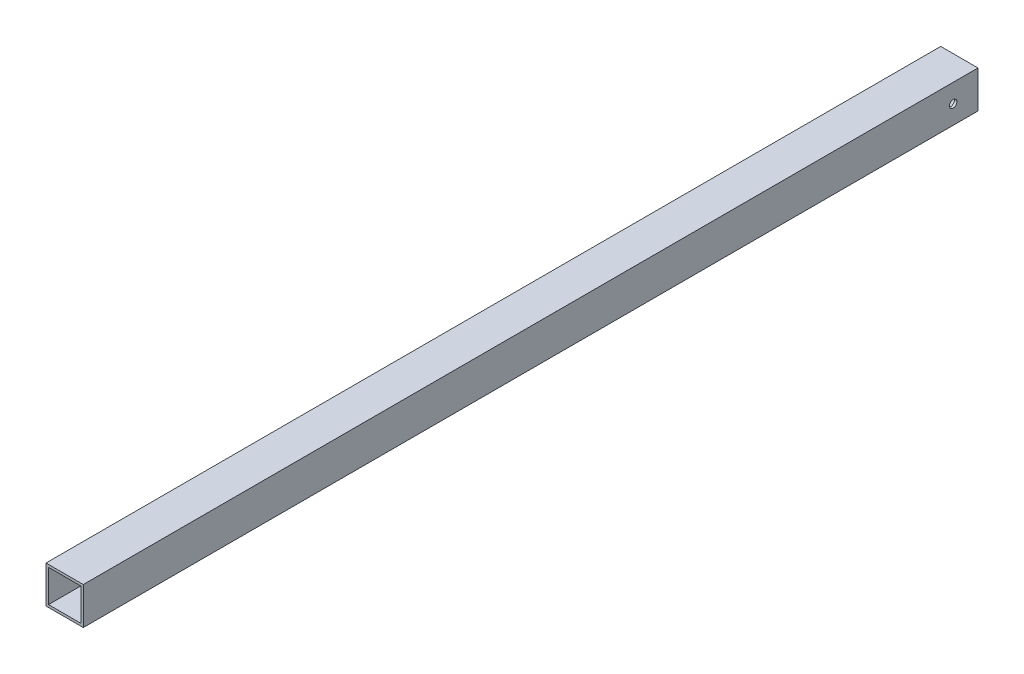
ISO-10303-21;
HEADER;
FILE_DESCRIPTION(('STEP AP214'),'2;1');
FILE_NAME('part.step','',(''),(''),'','','');
FILE_SCHEMA(('AUTOMOTIVE_DESIGN { 1 0 10303 214 1 1 1 1 }'));
ENDSEC;
DATA;
#1=APPLICATION_CONTEXT('core data for automotive mechanical design processes');
#2=APPLICATION_PROTOCOL_DEFINITION('international standard','automotive_design',2000,#1);
#3=PRODUCT_CONTEXT('',#1,'mechanical');
#4=PRODUCT('Part','Part','',(#3));
#5=PRODUCT_RELATED_PRODUCT_CATEGORY('part','',(#4));
#6=PRODUCT_DEFINITION_FORMATION('','',#4);
#7=PRODUCT_DEFINITION_CONTEXT('part definition',#1,'design');
#8=PRODUCT_DEFINITION('design','',#6,#7);
#9=PRODUCT_DEFINITION_SHAPE('','',#8);
#10=(LENGTH_UNIT() NAMED_UNIT(*) SI_UNIT(.MILLI.,.METRE.));
#11=(NAMED_UNIT(*) PLANE_ANGLE_UNIT() SI_UNIT($,.RADIAN.));
#12=(NAMED_UNIT(*) SI_UNIT($,.STERADIAN.) SOLID_ANGLE_UNIT());
#13=UNCERTAINTY_MEASURE_WITH_UNIT(LENGTH_MEASURE(1.E-05),#10,'distance_accuracy_value','');
#14=(GEOMETRIC_REPRESENTATION_CONTEXT(3) GLOBAL_UNCERTAINTY_ASSIGNED_CONTEXT((#13)) GLOBAL_UNIT_ASSIGNED_CONTEXT((#10,
#11,#12)) REPRESENTATION_CONTEXT('',''));
#15=CARTESIAN_POINT('',(0.,0.,0.));
#16=DIRECTION('',(0.,0.,1.));
#17=DIRECTION('',(1.,0.,0.));
#18=AXIS2_PLACEMENT_3D('',#15,#16,#17);
#19=CARTESIAN_POINT('',(0.,0.,360.));
#20=DIRECTION('',(0.,0.,1.));
#21=DIRECTION('',(1.,0.,0.));
#22=AXIS2_PLACEMENT_3D('',#19,#20,#21);
#23=PLANE('',#22);
#24=DIRECTION('',(0.,1.,0.));
#25=VECTOR('',#24,1.);
#26=CARTESIAN_POINT('',(7.5,7.5,360.));
#27=LINE('',#26,#25);
#28=CARTESIAN_POINT('',(7.5,-7.5,360.));
#29=VERTEX_POINT('',#28);
#30=CARTESIAN_POINT('',(7.5,7.5,360.));
#31=VERTEX_POINT('',#30);
#32=EDGE_CURVE('E138',#29,#31,#27,.T.);
#33=ORIENTED_EDGE('',*,*,#32,.T.);
#34=DIRECTION('',(-1.,0.,0.));
#35=VECTOR('',#34,1.);
#36=CARTESIAN_POINT('',(-7.5,7.5,360.));
#37=LINE('',#36,#35);
#38=CARTESIAN_POINT('',(-7.5,7.5,360.));
#39=VERTEX_POINT('',#38);
#40=EDGE_CURVE('E141',#31,#39,#37,.T.);
#41=ORIENTED_EDGE('',*,*,#40,.T.);
#42=DIRECTION('',(0.,-1.,0.));
#43=VECTOR('',#42,1.);
#44=CARTESIAN_POINT('',(-7.5,7.5,360.));
#45=LINE('',#44,#43);
#46=CARTESIAN_POINT('',(-7.5,-7.5,360.));
#47=VERTEX_POINT('',#46);
#48=EDGE_CURVE('E144',#39,#47,#45,.T.);
#49=ORIENTED_EDGE('',*,*,#48,.T.);
#50=DIRECTION('',(1.,0.,0.));
#51=VECTOR('',#50,1.);
#52=CARTESIAN_POINT('',(-7.5,-7.5,360.));
#53=LINE('',#52,#51);
#54=EDGE_CURVE('E146',#47,#29,#53,.T.);
#55=ORIENTED_EDGE('',*,*,#54,.T.);
#56=EDGE_LOOP('',(#33,#41,#49,#55));
#57=FACE_BOUND('',#56,.T.);
#58=DIRECTION('',(-1.,0.,0.));
#59=VECTOR('',#58,1.);
#60=CARTESIAN_POINT('',(-6.5,6.5,360.));
#61=LINE('',#60,#59);
#62=CARTESIAN_POINT('',(6.5,6.5,360.));
#63=VERTEX_POINT('',#62);
#64=CARTESIAN_POINT('',(-6.5,6.5,360.));
#65=VERTEX_POINT('',#64);
#66=EDGE_CURVE('E108',#63,#65,#61,.T.);
#67=ORIENTED_EDGE('',*,*,#66,.F.);
#68=DIRECTION('',(0.,1.,0.));
#69=VECTOR('',#68,1.);
#70=CARTESIAN_POINT('',(6.5,6.5,360.));
#71=LINE('',#70,#69);
#72=CARTESIAN_POINT('',(6.5,-6.5,360.));
#73=VERTEX_POINT('',#72);
#74=EDGE_CURVE('E100',#73,#63,#71,.T.);
#75=ORIENTED_EDGE('',*,*,#74,.F.);
#76=DIRECTION('',(1.,0.,0.));
#77=VECTOR('',#76,1.);
#78=CARTESIAN_POINT('',(-6.5,-6.5,360.));
#79=LINE('',#78,#77);
#80=CARTESIAN_POINT('',(-6.5,-6.5,360.));
#81=VERTEX_POINT('',#80);
#82=EDGE_CURVE('E122',#81,#73,#79,.T.);
#83=ORIENTED_EDGE('',*,*,#82,.F.);
#84=DIRECTION('',(0.,-1.,0.));
#85=VECTOR('',#84,1.);
#86=CARTESIAN_POINT('',(-6.5,6.5,360.));
#87=LINE('',#86,#85);
#88=EDGE_CURVE('E120',#65,#81,#87,.T.);
#89=ORIENTED_EDGE('',*,*,#88,.F.);
#90=EDGE_LOOP('',(#67,#75,#83,#89));
#91=FACE_BOUND('',#90,.T.);
#92=ADVANCED_FACE('F34',(#57,#91),#23,.T.);
#93=CARTESIAN_POINT('',(0.,0.,0.));
#94=DIRECTION('',(0.,0.,1.));
#95=DIRECTION('',(1.,0.,0.));
#96=AXIS2_PLACEMENT_3D('',#93,#94,#95);
#97=PLANE('',#96);
#98=DIRECTION('',(0.,1.,0.));
#99=VECTOR('',#98,1.);
#100=CARTESIAN_POINT('',(7.5,7.5,0.));
#101=LINE('',#100,#99);
#102=CARTESIAN_POINT('',(7.5,-7.5,0.));
#103=VERTEX_POINT('',#102);
#104=CARTESIAN_POINT('',(7.5,7.5,0.));
#105=VERTEX_POINT('',#104);
#106=EDGE_CURVE('E116',#103,#105,#101,.T.);
#107=ORIENTED_EDGE('',*,*,#106,.F.);
#108=DIRECTION('',(1.,0.,0.));
#109=VECTOR('',#108,1.);
#110=CARTESIAN_POINT('',(-7.5,-7.5,0.));
#111=LINE('',#110,#109);
#112=CARTESIAN_POINT('',(-7.5,-7.5,0.));
#113=VERTEX_POINT('',#112);
#114=EDGE_CURVE('E142',#113,#103,#111,.T.);
#115=ORIENTED_EDGE('',*,*,#114,.F.);
#116=DIRECTION('',(0.,-1.,0.));
#117=VECTOR('',#116,1.);
#118=CARTESIAN_POINT('',(-7.5,7.5,0.));
#119=LINE('',#118,#117);
#120=CARTESIAN_POINT('',(-7.5,7.5,0.));
#121=VERTEX_POINT('',#120);
#122=EDGE_CURVE('E153',#121,#113,#119,.T.);
#123=ORIENTED_EDGE('',*,*,#122,.F.);
#124=DIRECTION('',(-1.,0.,0.));
#125=VECTOR('',#124,1.);
#126=CARTESIAN_POINT('',(-7.5,7.5,0.));
#127=LINE('',#126,#125);
#128=EDGE_CURVE('E151',#105,#121,#127,.T.);
#129=ORIENTED_EDGE('',*,*,#128,.F.);
#130=EDGE_LOOP('',(#107,#115,#123,#129));
#131=FACE_BOUND('',#130,.T.);
#132=DIRECTION('',(0.,1.,0.));
#133=VECTOR('',#132,1.);
#134=CARTESIAN_POINT('',(6.5,6.5,0.));
#135=LINE('',#134,#133);
#136=CARTESIAN_POINT('',(6.5,-6.5,0.));
#137=VERTEX_POINT('',#136);
#138=CARTESIAN_POINT('',(6.5,6.5,0.));
#139=VERTEX_POINT('',#138);
#140=EDGE_CURVE('E58',#137,#139,#135,.T.);
#141=ORIENTED_EDGE('',*,*,#140,.T.);
#142=DIRECTION('',(-1.,0.,0.));
#143=VECTOR('',#142,1.);
#144=CARTESIAN_POINT('',(-6.5,6.5,0.));
#145=LINE('',#144,#143);
#146=CARTESIAN_POINT('',(-6.5,6.5,0.));
#147=VERTEX_POINT('',#146);
#148=EDGE_CURVE('E115',#139,#147,#145,.T.);
#149=ORIENTED_EDGE('',*,*,#148,.T.);
#150=DIRECTION('',(0.,-1.,0.));
#151=VECTOR('',#150,1.);
#152=CARTESIAN_POINT('',(-6.5,6.5,0.));
#153=LINE('',#152,#151);
#154=CARTESIAN_POINT('',(-6.5,-6.5,0.));
#155=VERTEX_POINT('',#154);
#156=EDGE_CURVE('E130',#147,#155,#153,.T.);
#157=ORIENTED_EDGE('',*,*,#156,.T.);
#158=DIRECTION('',(1.,0.,0.));
#159=VECTOR('',#158,1.);
#160=CARTESIAN_POINT('',(-6.5,-6.5,0.));
#161=LINE('',#160,#159);
#162=EDGE_CURVE('E109',#155,#137,#161,.T.);
#163=ORIENTED_EDGE('',*,*,#162,.T.);
#164=EDGE_LOOP('',(#141,#149,#157,#163));
#165=FACE_BOUND('',#164,.T.);
#166=ADVANCED_FACE('F172',(#131,#165),#97,.F.);
#167=CARTESIAN_POINT('',(7.5,7.5,360.));
#168=DIRECTION('',(-1.,0.,0.));
#169=DIRECTION('',(0.,0.,1.));
#170=AXIS2_PLACEMENT_3D('',#167,#168,#169);
#171=PLANE('',#170);
#172=CARTESIAN_POINT('',(7.5,0.,10.));
#173=DIRECTION('',(-1.,0.,0.));
#174=DIRECTION('',(0.,0.,1.));
#175=AXIS2_PLACEMENT_3D('',#172,#173,#174);
#176=CIRCLE('',#175,1.5);
#177=CARTESIAN_POINT('',(7.5,-1.5,10.));
#178=VERTEX_POINT('',#177);
#179=EDGE_CURVE('E128',#178,#178,#176,.T.);
#180=ORIENTED_EDGE('',*,*,#179,.T.);
#181=EDGE_LOOP('',(#180));
#182=FACE_BOUND('',#181,.T.);
#183=ORIENTED_EDGE('',*,*,#106,.T.);
#184=DIRECTION('',(0.,0.,-1.));
#185=VECTOR('',#184,1.);
#186=CARTESIAN_POINT('',(7.5,7.5,360.));
#187=LINE('',#186,#185);
#188=EDGE_CURVE('E11',#31,#105,#187,.T.);
#189=ORIENTED_EDGE('',*,*,#188,.F.);
#190=ORIENTED_EDGE('',*,*,#32,.F.);
#191=DIRECTION('',(0.,0.,-1.));
#192=VECTOR('',#191,1.);
#193=CARTESIAN_POINT('',(7.5,-7.5,360.));
#194=LINE('',#193,#192);
#195=EDGE_CURVE('E148',#29,#103,#194,.T.);
#196=ORIENTED_EDGE('',*,*,#195,.T.);
#197=EDGE_LOOP('',(#183,#189,#190,#196));
#198=FACE_BOUND('',#197,.T.);
#199=ADVANCED_FACE('F36',(#182,#198),#171,.F.);
#200=CARTESIAN_POINT('',(-7.5,7.5,360.));
#201=DIRECTION('',(0.,-1.,0.));
#202=DIRECTION('',(0.,0.,-1.));
#203=AXIS2_PLACEMENT_3D('',#200,#201,#202);
#204=PLANE('',#203);
#205=ORIENTED_EDGE('',*,*,#128,.T.);
#206=DIRECTION('',(0.,0.,-1.));
#207=VECTOR('',#206,1.);
#208=CARTESIAN_POINT('',(-7.5,7.5,360.));
#209=LINE('',#208,#207);
#210=EDGE_CURVE('E43',#39,#121,#209,.T.);
#211=ORIENTED_EDGE('',*,*,#210,.F.);
#212=ORIENTED_EDGE('',*,*,#40,.F.);
#213=ORIENTED_EDGE('',*,*,#188,.T.);
#214=EDGE_LOOP('',(#205,#211,#212,#213));
#215=FACE_BOUND('',#214,.T.);
#216=ADVANCED_FACE('F182',(#215),#204,.F.);
#217=CARTESIAN_POINT('',(-7.5,7.5,360.));
#218=DIRECTION('',(1.,0.,0.));
#219=DIRECTION('',(0.,1.,0.));
#220=AXIS2_PLACEMENT_3D('',#217,#218,#219);
#221=PLANE('',#220);
#222=CARTESIAN_POINT('',(-7.5,0.,10.));
#223=DIRECTION('',(-1.,0.,0.));
#224=DIRECTION('',(0.,-1.,0.));
#225=AXIS2_PLACEMENT_3D('',#222,#223,#224);
#226=CIRCLE('',#225,1.5);
#227=CARTESIAN_POINT('',(-7.5,-1.5,10.));
#228=VERTEX_POINT('',#227);
#229=EDGE_CURVE('E216',#228,#228,#226,.T.);
#230=ORIENTED_EDGE('',*,*,#229,.F.);
#231=EDGE_LOOP('',(#230));
#232=FACE_BOUND('',#231,.T.);
#233=ORIENTED_EDGE('',*,*,#122,.T.);
#234=DIRECTION('',(0.,0.,-1.));
#235=VECTOR('',#234,1.);
#236=CARTESIAN_POINT('',(-7.5,-7.5,360.));
#237=LINE('',#236,#235);
#238=EDGE_CURVE('E158',#47,#113,#237,.T.);
#239=ORIENTED_EDGE('',*,*,#238,.F.);
#240=ORIENTED_EDGE('',*,*,#48,.F.);
#241=ORIENTED_EDGE('',*,*,#210,.T.);
#242=EDGE_LOOP('',(#233,#239,#240,#241));
#243=FACE_BOUND('',#242,.T.);
#244=ADVANCED_FACE('F166',(#232,#243),#221,.F.);
#245=CARTESIAN_POINT('',(-7.5,-7.5,360.));
#246=DIRECTION('',(0.,1.,0.));
#247=DIRECTION('',(0.,0.,1.));
#248=AXIS2_PLACEMENT_3D('',#245,#246,#247);
#249=PLANE('',#248);
#250=ORIENTED_EDGE('',*,*,#114,.T.);
#251=ORIENTED_EDGE('',*,*,#195,.F.);
#252=ORIENTED_EDGE('',*,*,#54,.F.);
#253=ORIENTED_EDGE('',*,*,#238,.T.);
#254=EDGE_LOOP('',(#250,#251,#252,#253));
#255=FACE_BOUND('',#254,.T.);
#256=ADVANCED_FACE('F176',(#255),#249,.F.);
#257=CARTESIAN_POINT('',(6.5,6.5,360.));
#258=DIRECTION('',(-1.,0.,0.));
#259=DIRECTION('',(0.,-1.,0.));
#260=AXIS2_PLACEMENT_3D('',#257,#258,#259);
#261=PLANE('',#260);
#262=CARTESIAN_POINT('',(6.5,0.,10.));
#263=DIRECTION('',(-1.,0.,0.));
#264=DIRECTION('',(0.,-1.,0.));
#265=AXIS2_PLACEMENT_3D('',#262,#263,#264);
#266=CIRCLE('',#265,1.5);
#267=CARTESIAN_POINT('',(6.5,-1.5,10.));
#268=VERTEX_POINT('',#267);
#269=EDGE_CURVE('E211',#268,#268,#266,.T.);
#270=ORIENTED_EDGE('',*,*,#269,.F.);
#271=EDGE_LOOP('',(#270));
#272=FACE_BOUND('',#271,.T.);
#273=ORIENTED_EDGE('',*,*,#140,.F.);
#274=DIRECTION('',(0.,0.,-1.));
#275=VECTOR('',#274,1.);
#276=CARTESIAN_POINT('',(6.5,-6.5,360.));
#277=LINE('',#276,#275);
#278=EDGE_CURVE('E104',#73,#137,#277,.T.);
#279=ORIENTED_EDGE('',*,*,#278,.F.);
#280=ORIENTED_EDGE('',*,*,#74,.T.);
#281=DIRECTION('',(0.,0.,-1.));
#282=VECTOR('',#281,1.);
#283=CARTESIAN_POINT('',(6.5,6.5,360.));
#284=LINE('',#283,#282);
#285=EDGE_CURVE('E103',#63,#139,#284,.T.);
#286=ORIENTED_EDGE('',*,*,#285,.T.);
#287=EDGE_LOOP('',(#273,#279,#280,#286));
#288=FACE_BOUND('',#287,.T.);
#289=ADVANCED_FACE('F102',(#272,#288),#261,.T.);
#290=CARTESIAN_POINT('',(-6.5,6.5,360.));
#291=DIRECTION('',(0.,-1.,0.));
#292=DIRECTION('',(0.,0.,-1.));
#293=AXIS2_PLACEMENT_3D('',#290,#291,#292);
#294=PLANE('',#293);
#295=ORIENTED_EDGE('',*,*,#148,.F.);
#296=ORIENTED_EDGE('',*,*,#285,.F.);
#297=ORIENTED_EDGE('',*,*,#66,.T.);
#298=DIRECTION('',(0.,0.,-1.));
#299=VECTOR('',#298,1.);
#300=CARTESIAN_POINT('',(-6.5,6.5,360.));
#301=LINE('',#300,#299);
#302=EDGE_CURVE('E117',#65,#147,#301,.T.);
#303=ORIENTED_EDGE('',*,*,#302,.T.);
#304=EDGE_LOOP('',(#295,#296,#297,#303));
#305=FACE_BOUND('',#304,.T.);
#306=ADVANCED_FACE('F112',(#305),#294,.T.);
#307=CARTESIAN_POINT('',(-6.5,6.5,360.));
#308=DIRECTION('',(1.,0.,0.));
#309=DIRECTION('',(0.,0.,-1.));
#310=AXIS2_PLACEMENT_3D('',#307,#308,#309);
#311=PLANE('',#310);
#312=CARTESIAN_POINT('',(-6.5,0.,10.));
#313=DIRECTION('',(1.,0.,0.));
#314=DIRECTION('',(0.,0.,-1.));
#315=AXIS2_PLACEMENT_3D('',#312,#313,#314);
#316=CIRCLE('',#315,1.5);
#317=CARTESIAN_POINT('',(-6.5,0.,8.5));
#318=VERTEX_POINT('',#317);
#319=EDGE_CURVE('E38',#318,#318,#316,.T.);
#320=ORIENTED_EDGE('',*,*,#319,.F.);
#321=EDGE_LOOP('',(#320));
#322=FACE_BOUND('',#321,.T.);
#323=ORIENTED_EDGE('',*,*,#156,.F.);
#324=ORIENTED_EDGE('',*,*,#302,.F.);
#325=ORIENTED_EDGE('',*,*,#88,.T.);
#326=DIRECTION('',(0.,0.,-1.));
#327=VECTOR('',#326,1.);
#328=CARTESIAN_POINT('',(-6.5,-6.5,360.));
#329=LINE('',#328,#327);
#330=EDGE_CURVE('E50',#81,#155,#329,.T.);
#331=ORIENTED_EDGE('',*,*,#330,.T.);
#332=EDGE_LOOP('',(#323,#324,#325,#331));
#333=FACE_BOUND('',#332,.T.);
#334=ADVANCED_FACE('F208',(#322,#333),#311,.T.);
#335=CARTESIAN_POINT('',(-6.5,-6.5,360.));
#336=DIRECTION('',(0.,1.,0.));
#337=DIRECTION('',(0.,0.,1.));
#338=AXIS2_PLACEMENT_3D('',#335,#336,#337);
#339=PLANE('',#338);
#340=ORIENTED_EDGE('',*,*,#162,.F.);
#341=ORIENTED_EDGE('',*,*,#330,.F.);
#342=ORIENTED_EDGE('',*,*,#82,.T.);
#343=ORIENTED_EDGE('',*,*,#278,.T.);
#344=EDGE_LOOP('',(#340,#341,#342,#343));
#345=FACE_BOUND('',#344,.T.);
#346=ADVANCED_FACE('F224',(#345),#339,.T.);
#347=CARTESIAN_POINT('',(17.5,0.,10.));
#348=DIRECTION('',(-1.,0.,0.));
#349=DIRECTION('',(0.,-1.,0.));
#350=AXIS2_PLACEMENT_3D('',#347,#348,#349);
#351=CYLINDRICAL_SURFACE('',#350,1.5);
#352=ORIENTED_EDGE('',*,*,#319,.T.);
#353=EDGE_LOOP('',(#352));
#354=FACE_BOUND('',#353,.T.);
#355=ORIENTED_EDGE('',*,*,#229,.T.);
#356=EDGE_LOOP('',(#355));
#357=FACE_BOUND('',#356,.T.);
#358=ADVANCED_FACE('F221',(#354,#357),#351,.F.);
#359=CARTESIAN_POINT('',(6.5,-1.5,10.));
#360=CARTESIAN_POINT('',(6.51041666666667,-1.5,10.));
#361=CARTESIAN_POINT('',(6.52083333333333,-1.5,10.));
#362=CARTESIAN_POINT('',(6.54166666666667,-1.5,10.));
#363=CARTESIAN_POINT('',(6.55208333333333,-1.5,10.));
#364=CARTESIAN_POINT('',(6.57291666666667,-1.5,10.));
#365=CARTESIAN_POINT('',(6.58333333333333,-1.5,10.));
#366=CARTESIAN_POINT('',(6.60416666666667,-1.5,10.));
#367=CARTESIAN_POINT('',(6.61458333333333,-1.5,10.));
#368=CARTESIAN_POINT('',(6.63541666666667,-1.5,10.));
#369=CARTESIAN_POINT('',(6.64583333333333,-1.5,10.));
#370=CARTESIAN_POINT('',(6.66666666666667,-1.5,10.));
#371=CARTESIAN_POINT('',(6.67708333333333,-1.5,10.));
#372=CARTESIAN_POINT('',(6.69791666666667,-1.5,10.));
#373=CARTESIAN_POINT('',(6.70833333333333,-1.5,10.));
#374=CARTESIAN_POINT('',(6.72916666666667,-1.5,10.));
#375=CARTESIAN_POINT('',(6.73958333333333,-1.5,10.));
#376=CARTESIAN_POINT('',(6.76041666666667,-1.5,10.));
#377=CARTESIAN_POINT('',(6.77083333333333,-1.5,10.));
#378=CARTESIAN_POINT('',(6.79166666666667,-1.5,10.));
#379=CARTESIAN_POINT('',(6.80208333333333,-1.5,10.));
#380=CARTESIAN_POINT('',(6.82291666666667,-1.5,10.));
#381=CARTESIAN_POINT('',(6.83333333333333,-1.5,10.));
#382=CARTESIAN_POINT('',(6.85416666666667,-1.5,10.));
#383=CARTESIAN_POINT('',(6.86458333333333,-1.5,10.));
#384=CARTESIAN_POINT('',(6.88541666666667,-1.5,10.));
#385=CARTESIAN_POINT('',(6.89583333333333,-1.5,10.));
#386=CARTESIAN_POINT('',(6.91666666666667,-1.5,10.));
#387=CARTESIAN_POINT('',(6.92708333333333,-1.5,10.));
#388=CARTESIAN_POINT('',(6.94791666666667,-1.5,10.));
#389=CARTESIAN_POINT('',(6.95833333333333,-1.5,10.));
#390=CARTESIAN_POINT('',(6.97916666666667,-1.5,10.));
#391=CARTESIAN_POINT('',(6.98958333333333,-1.5,10.));
#392=CARTESIAN_POINT('',(7.01041666666667,-1.5,10.));
#393=CARTESIAN_POINT('',(7.02083333333333,-1.5,10.));
#394=CARTESIAN_POINT('',(7.04166666666667,-1.5,10.));
#395=CARTESIAN_POINT('',(7.05208333333333,-1.5,10.));
#396=CARTESIAN_POINT('',(7.07291666666667,-1.5,10.));
#397=CARTESIAN_POINT('',(7.08333333333333,-1.5,10.));
#398=CARTESIAN_POINT('',(7.10416666666667,-1.5,10.));
#399=CARTESIAN_POINT('',(7.11458333333333,-1.5,10.));
#400=CARTESIAN_POINT('',(7.13541666666667,-1.5,10.));
#401=CARTESIAN_POINT('',(7.14583333333333,-1.5,10.));
#402=CARTESIAN_POINT('',(7.16666666666667,-1.5,10.));
#403=CARTESIAN_POINT('',(7.17708333333333,-1.5,10.));
#404=CARTESIAN_POINT('',(7.19791666666667,-1.5,10.));
#405=CARTESIAN_POINT('',(7.20833333333333,-1.5,10.));
#406=CARTESIAN_POINT('',(7.22916666666667,-1.5,10.));
#407=CARTESIAN_POINT('',(7.23958333333333,-1.5,10.));
#408=CARTESIAN_POINT('',(7.26041666666667,-1.5,10.));
#409=CARTESIAN_POINT('',(7.27083333333333,-1.5,10.));
#410=CARTESIAN_POINT('',(7.29166666666667,-1.5,10.));
#411=CARTESIAN_POINT('',(7.30208333333333,-1.5,10.));
#412=CARTESIAN_POINT('',(7.32291666666667,-1.5,10.));
#413=CARTESIAN_POINT('',(7.33333333333333,-1.5,10.));
#414=CARTESIAN_POINT('',(7.35416666666667,-1.5,10.));
#415=CARTESIAN_POINT('',(7.36458333333333,-1.5,10.));
#416=CARTESIAN_POINT('',(7.38541666666667,-1.5,10.));
#417=CARTESIAN_POINT('',(7.39583333333333,-1.5,10.));
#418=CARTESIAN_POINT('',(7.41666666666667,-1.5,10.));
#419=CARTESIAN_POINT('',(7.42708333333333,-1.5,10.));
#420=CARTESIAN_POINT('',(7.44791666666667,-1.5,10.));
#421=CARTESIAN_POINT('',(7.45833333333333,-1.5,10.));
#422=CARTESIAN_POINT('',(7.47916666666667,-1.5,10.));
#423=CARTESIAN_POINT('',(7.48958333333333,-1.5,10.));
#424=CARTESIAN_POINT('',(7.5,-1.5,10.));
#425=B_SPLINE_CURVE_WITH_KNOTS('',3,(#359,#360,#361,#362,#363,#364,#365,#366,#367,#368,#369,
#370,#371,#372,#373,#374,#375,#376,#377,#378,#379,#380,#381,#382,#383,#384,#385,#386,#387,#388,
#389,#390,#391,#392,#393,#394,#395,#396,#397,#398,#399,#400,#401,#402,#403,#404,#405,#406,#407,
#408,#409,#410,#411,#412,#413,#414,#415,#416,#417,#418,#419,#420,#421,#422,#423,#424),
.UNSPECIFIED.,.F.,.F.,(4,2,2,2,2,2,2,2,2,2,2,2,2,2,2,2,2,2,2,2,2,2,2,2,2,2,2,2,2,2,2,2,4),(0.,
0.03125,0.0625000000000001,0.0937500000000001,0.125,0.15625,0.1875,0.21875,0.25,0.28125,0.3125,
0.34375,0.375,0.40625,0.4375,0.46875,0.5,0.53125,0.5625,0.593750000000001,0.625000000000001,
0.656250000000001,0.687500000000001,0.718750000000001,0.750000000000001,0.781250000000001,
0.812500000000001,0.843750000000001,0.875000000000001,0.906250000000001,0.937500000000001,
0.968750000000001,1.),.UNSPECIFIED.);
#426=EDGE_CURVE('BSEAM223',#268,#178,#425,.T.);
#427=ORIENTED_EDGE('',*,*,#269,.T.);
#428=ORIENTED_EDGE('',*,*,#179,.F.);
#429=ORIENTED_EDGE('',*,*,#426,.T.);
#430=ORIENTED_EDGE('',*,*,#426,.F.);
#431=EDGE_LOOP('',(#427,#429,#428,#430));
#432=FACE_BOUND('',#431,.T.);
#433=ADVANCED_FACE('F223',(#432),#351,.F.);
#434=CLOSED_SHELL('',(#92,#166,#199,#216,#244,#256,#289,#306,#334,#346,#358,#433));
#435=MANIFOLD_SOLID_BREP('B2',#434);
#436=ADVANCED_BREP_SHAPE_REPRESENTATION('',(#18,#435),#14);
#437=SHAPE_DEFINITION_REPRESENTATION(#9,#436);
ENDSEC;
END-ISO-10303-21;
